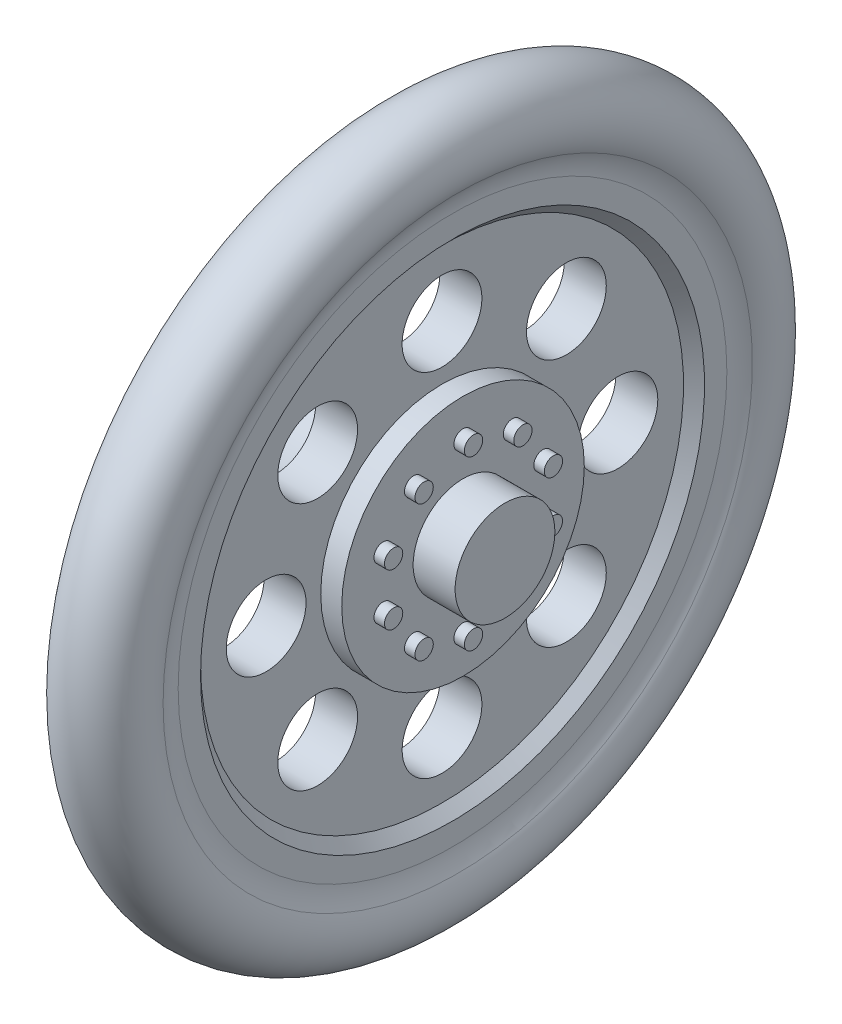
ISO-10303-21;
HEADER;
FILE_DESCRIPTION(('STEP AP214'),'2;1');
FILE_NAME('part.step','',(''),(''),'','','');
FILE_SCHEMA(('AUTOMOTIVE_DESIGN { 1 0 10303 214 1 1 1 1 }'));
ENDSEC;
DATA;
#1=APPLICATION_CONTEXT('core data for automotive mechanical design processes');
#2=APPLICATION_PROTOCOL_DEFINITION('international standard','automotive_design',2000,#1);
#3=PRODUCT_CONTEXT('',#1,'mechanical');
#4=PRODUCT('Part','Part','',(#3));
#5=PRODUCT_RELATED_PRODUCT_CATEGORY('part','',(#4));
#6=PRODUCT_DEFINITION_FORMATION('','',#4);
#7=PRODUCT_DEFINITION_CONTEXT('part definition',#1,'design');
#8=PRODUCT_DEFINITION('design','',#6,#7);
#9=PRODUCT_DEFINITION_SHAPE('','',#8);
#10=(LENGTH_UNIT() NAMED_UNIT(*) SI_UNIT(.MILLI.,.METRE.));
#11=(NAMED_UNIT(*) PLANE_ANGLE_UNIT() SI_UNIT($,.RADIAN.));
#12=(NAMED_UNIT(*) SI_UNIT($,.STERADIAN.) SOLID_ANGLE_UNIT());
#13=UNCERTAINTY_MEASURE_WITH_UNIT(LENGTH_MEASURE(1.E-05),#10,'distance_accuracy_value','');
#14=(GEOMETRIC_REPRESENTATION_CONTEXT(3) GLOBAL_UNCERTAINTY_ASSIGNED_CONTEXT((#13)) GLOBAL_UNIT_ASSIGNED_CONTEXT((#10,
#11,#12)) REPRESENTATION_CONTEXT('',''));
#15=CARTESIAN_POINT('',(0.,0.,0.));
#16=DIRECTION('',(0.,0.,1.));
#17=DIRECTION('',(1.,0.,0.));
#18=AXIS2_PLACEMENT_3D('',#15,#16,#17);
#19=CARTESIAN_POINT('',(10.5,0.,0.));
#20=DIRECTION('',(1.,0.,0.));
#21=DIRECTION('',(0.,0.,-1.));
#22=AXIS2_PLACEMENT_3D('',#19,#20,#21);
#23=PLANE('',#22);
#24=CARTESIAN_POINT('',(10.5,1.23606797749983,-3.8042260651806));
#25=DIRECTION('',(1.,0.,0.));
#26=DIRECTION('',(0.,-0.95105651629515,-0.309016994374958));
#27=AXIS2_PLACEMENT_3D('',#24,#25,#26);
#28=CIRCLE('',#27,0.435);
#29=CARTESIAN_POINT('',(10.5,0.822358392911443,-3.93864845773371));
#30=VERTEX_POINT('',#29);
#31=EDGE_CURVE('E100',#30,#30,#28,.T.);
#32=ORIENTED_EDGE('',*,*,#31,.F.);
#33=EDGE_LOOP('',(#32));
#34=FACE_BOUND('',#33,.T.);
#35=CARTESIAN_POINT('',(10.5,-3.23606797749977,-2.35114100916992));
#36=DIRECTION('',(1.,0.,0.));
#37=DIRECTION('',(0.,-0.58778525229248,0.809016994374942));
#38=AXIS2_PLACEMENT_3D('',#35,#36,#37);
#39=CIRCLE('',#38,0.435);
#40=CARTESIAN_POINT('',(10.5,-3.491754562247,-1.99921861661682));
#41=VERTEX_POINT('',#40);
#42=EDGE_CURVE('E112',#41,#41,#39,.T.);
#43=ORIENTED_EDGE('',*,*,#42,.F.);
#44=EDGE_LOOP('',(#43));
#45=FACE_BOUND('',#44,.T.);
#46=CARTESIAN_POINT('',(10.5,-3.2360679774998,2.35114100916987));
#47=DIRECTION('',(1.,0.,0.));
#48=DIRECTION('',(0.,0.587785252292469,0.809016994374951));
#49=AXIS2_PLACEMENT_3D('',#46,#47,#48);
#50=CIRCLE('',#49,0.435);
#51=CARTESIAN_POINT('',(10.5,-2.98038139275258,2.70306340172298));
#52=VERTEX_POINT('',#51);
#53=EDGE_CURVE('E124',#52,#52,#50,.T.);
#54=ORIENTED_EDGE('',*,*,#53,.F.);
#55=EDGE_LOOP('',(#54));
#56=FACE_BOUND('',#55,.T.);
#57=CARTESIAN_POINT('',(10.5,1.23606797749978,3.80422606518062));
#58=DIRECTION('',(1.,0.,0.));
#59=DIRECTION('',(0.,0.951056516295155,-0.309016994374945));
#60=AXIS2_PLACEMENT_3D('',#57,#58,#59);
#61=CIRCLE('',#60,0.435);
#62=CARTESIAN_POINT('',(10.5,1.64977756208817,3.66980367262752));
#63=VERTEX_POINT('',#62);
#64=EDGE_CURVE('E136',#63,#63,#61,.T.);
#65=ORIENTED_EDGE('',*,*,#64,.F.);
#66=EDGE_LOOP('',(#65));
#67=FACE_BOUND('',#66,.T.);
#68=CARTESIAN_POINT('',(10.5,4.,0.));
#69=DIRECTION('',(1.,0.,0.));
#70=DIRECTION('',(0.,0.,-1.));
#71=AXIS2_PLACEMENT_3D('',#68,#69,#70);
#72=CIRCLE('',#71,0.435);
#73=CARTESIAN_POINT('',(10.5,4.,-0.435));
#74=VERTEX_POINT('',#73);
#75=EDGE_CURVE('E148',#74,#74,#72,.T.);
#76=ORIENTED_EDGE('',*,*,#75,.F.);
#77=EDGE_LOOP('',(#76));
#78=FACE_BOUND('',#77,.T.);
#79=CARTESIAN_POINT('',(10.5,0.,0.));
#80=DIRECTION('',(1.,0.,0.));
#81=DIRECTION('',(0.,0.,-1.));
#82=AXIS2_PLACEMENT_3D('',#79,#80,#81);
#83=CIRCLE('',#82,5.775);
#84=CARTESIAN_POINT('',(10.5,0.,-5.775));
#85=VERTEX_POINT('',#84);
#86=EDGE_CURVE('E160',#85,#85,#83,.T.);
#87=ORIENTED_EDGE('',*,*,#86,.T.);
#88=EDGE_LOOP('',(#87));
#89=FACE_BOUND('',#88,.T.);
#90=CARTESIAN_POINT('',(10.5,0.,0.));
#91=DIRECTION('',(1.,0.,0.));
#92=DIRECTION('',(0.,0.,-1.));
#93=AXIS2_PLACEMENT_3D('',#90,#91,#92);
#94=CIRCLE('',#93,2.375);
#95=CARTESIAN_POINT('',(10.5,0.,-2.375));
#96=VERTEX_POINT('',#95);
#97=EDGE_CURVE('E154',#96,#96,#94,.T.);
#98=ORIENTED_EDGE('',*,*,#97,.F.);
#99=EDGE_LOOP('',(#98));
#100=FACE_BOUND('',#99,.T.);
#101=CARTESIAN_POINT('',(10.5,3.23606797749979,2.3511410091699));
#102=DIRECTION('',(1.,0.,0.));
#103=DIRECTION('',(0.,0.587785252292474,-0.809016994374947));
#104=AXIS2_PLACEMENT_3D('',#101,#102,#103);
#105=CIRCLE('',#104,0.435);
#106=CARTESIAN_POINT('',(10.5,3.49175456224701,1.9992186166168));
#107=VERTEX_POINT('',#106);
#108=EDGE_CURVE('E142',#107,#107,#105,.T.);
#109=ORIENTED_EDGE('',*,*,#108,.F.);
#110=EDGE_LOOP('',(#109));
#111=FACE_BOUND('',#110,.T.);
#112=CARTESIAN_POINT('',(10.5,-1.23606797749981,3.80422606518061));
#113=DIRECTION('',(1.,0.,0.));
#114=DIRECTION('',(0.,0.951056516295152,0.309016994374952));
#115=AXIS2_PLACEMENT_3D('',#112,#113,#114);
#116=CIRCLE('',#115,0.435);
#117=CARTESIAN_POINT('',(10.5,-0.822358392911415,3.93864845773371));
#118=VERTEX_POINT('',#117);
#119=EDGE_CURVE('E130',#118,#118,#116,.T.);
#120=ORIENTED_EDGE('',*,*,#119,.F.);
#121=EDGE_LOOP('',(#120));
#122=FACE_BOUND('',#121,.T.);
#123=CARTESIAN_POINT('',(10.5,-4.,0.));
#124=DIRECTION('',(1.,0.,0.));
#125=DIRECTION('',(0.,0.,1.));
#126=AXIS2_PLACEMENT_3D('',#123,#124,#125);
#127=CIRCLE('',#126,0.435);
#128=CARTESIAN_POINT('',(10.5,-4.,0.434999999999972));
#129=VERTEX_POINT('',#128);
#130=EDGE_CURVE('E118',#129,#129,#127,.T.);
#131=ORIENTED_EDGE('',*,*,#130,.F.);
#132=EDGE_LOOP('',(#131));
#133=FACE_BOUND('',#132,.T.);
#134=CARTESIAN_POINT('',(10.5,-1.23606797749975,-3.80422606518063));
#135=DIRECTION('',(1.,0.,0.));
#136=DIRECTION('',(0.,-0.951056516295157,0.309016994374938));
#137=AXIS2_PLACEMENT_3D('',#134,#135,#136);
#138=CIRCLE('',#137,0.435);
#139=CARTESIAN_POINT('',(10.5,-1.64977756208815,-3.66980367262753));
#140=VERTEX_POINT('',#139);
#141=EDGE_CURVE('E106',#140,#140,#138,.T.);
#142=ORIENTED_EDGE('',*,*,#141,.F.);
#143=EDGE_LOOP('',(#142));
#144=FACE_BOUND('',#143,.T.);
#145=CARTESIAN_POINT('',(10.5,3.23606797749982,-2.35114100916985));
#146=DIRECTION('',(1.,0.,0.));
#147=DIRECTION('',(0.,-0.587785252292462,-0.809016994374955));
#148=AXIS2_PLACEMENT_3D('',#145,#146,#147);
#149=CIRCLE('',#148,0.435);
#150=CARTESIAN_POINT('',(10.5,2.9803813927526,-2.70306340172296));
#151=VERTEX_POINT('',#150);
#152=EDGE_CURVE('E50',#151,#151,#149,.T.);
#153=ORIENTED_EDGE('',*,*,#152,.F.);
#154=EDGE_LOOP('',(#153));
#155=FACE_BOUND('',#154,.T.);
#156=ADVANCED_FACE('F30',(#34,#45,#56,#67,#78,#89,#100,#111,#122,#133,#144,#155),#23,.T.);
#157=CARTESIAN_POINT('',(9.5,11.5,0.));
#158=DIRECTION('',(-1.,0.,0.));
#159=DIRECTION('',(0.,0.,1.));
#160=AXIS2_PLACEMENT_3D('',#157,#158,#159);
#161=PLANE('',#160);
#162=CARTESIAN_POINT('',(9.5,5.92201929243741,-5.92201929243726));
#163=DIRECTION('',(1.,0.,0.));
#164=DIRECTION('',(0.,-0.707106781186539,-0.707106781186556));
#165=AXIS2_PLACEMENT_3D('',#162,#163,#164);
#166=CIRCLE('',#165,1.9);
#167=CARTESIAN_POINT('',(9.5,4.57851640818298,-7.26552217669172));
#168=VERTEX_POINT('',#167);
#169=EDGE_CURVE('E83',#168,#168,#166,.T.);
#170=ORIENTED_EDGE('',*,*,#169,.F.);
#171=EDGE_LOOP('',(#170));
#172=FACE_BOUND('',#171,.T.);
#173=CARTESIAN_POINT('',(9.5,0.,-8.375));
#174=DIRECTION('',(1.,0.,0.));
#175=DIRECTION('',(0.,-1.,0.));
#176=AXIS2_PLACEMENT_3D('',#173,#174,#175);
#177=CIRCLE('',#176,1.9);
#178=CARTESIAN_POINT('',(9.5,-1.89999999999991,-8.37500000000002));
#179=VERTEX_POINT('',#178);
#180=EDGE_CURVE('E73',#179,#179,#177,.T.);
#181=ORIENTED_EDGE('',*,*,#180,.F.);
#182=EDGE_LOOP('',(#181));
#183=FACE_BOUND('',#182,.T.);
#184=CARTESIAN_POINT('',(9.5,-5.92201929243728,-5.92201929243739));
#185=DIRECTION('',(1.,0.,0.));
#186=DIRECTION('',(0.,-0.707106781186554,0.707106781186541));
#187=AXIS2_PLACEMENT_3D('',#184,#185,#186);
#188=CIRCLE('',#187,1.9);
#189=CARTESIAN_POINT('',(9.5,-7.26552217669174,-4.57851640818296));
#190=VERTEX_POINT('',#189);
#191=EDGE_CURVE('E70',#190,#190,#188,.T.);
#192=ORIENTED_EDGE('',*,*,#191,.F.);
#193=EDGE_LOOP('',(#192));
#194=FACE_BOUND('',#193,.T.);
#195=CARTESIAN_POINT('',(9.5,-8.375,0.));
#196=DIRECTION('',(1.,0.,0.));
#197=DIRECTION('',(0.,0.,1.));
#198=AXIS2_PLACEMENT_3D('',#195,#196,#197);
#199=CIRCLE('',#198,1.9);
#200=CARTESIAN_POINT('',(9.5,-8.37500000000001,1.89999999999994));
#201=VERTEX_POINT('',#200);
#202=EDGE_CURVE('E67',#201,#201,#199,.T.);
#203=ORIENTED_EDGE('',*,*,#202,.F.);
#204=EDGE_LOOP('',(#203));
#205=FACE_BOUND('',#204,.T.);
#206=CARTESIAN_POINT('',(9.5,-5.92201929243737,5.92201929243731));
#207=DIRECTION('',(1.,0.,0.));
#208=DIRECTION('',(0.,0.707106781186544,0.707106781186551));
#209=AXIS2_PLACEMENT_3D('',#206,#207,#208);
#210=CIRCLE('',#209,1.9);
#211=CARTESIAN_POINT('',(9.5,-4.57851640818293,7.26552217669175));
#212=VERTEX_POINT('',#211);
#213=EDGE_CURVE('E63',#212,#212,#210,.T.);
#214=ORIENTED_EDGE('',*,*,#213,.F.);
#215=EDGE_LOOP('',(#214));
#216=FACE_BOUND('',#215,.T.);
#217=CARTESIAN_POINT('',(9.5,0.,8.375));
#218=DIRECTION('',(1.,0.,0.));
#219=DIRECTION('',(0.,1.,0.));
#220=AXIS2_PLACEMENT_3D('',#217,#218,#219);
#221=CIRCLE('',#220,1.9);
#222=CARTESIAN_POINT('',(9.5,1.89999999999997,8.37500000000001));
#223=VERTEX_POINT('',#222);
#224=EDGE_CURVE('E59',#223,#223,#221,.T.);
#225=ORIENTED_EDGE('',*,*,#224,.F.);
#226=EDGE_LOOP('',(#225));
#227=FACE_BOUND('',#226,.T.);
#228=CARTESIAN_POINT('',(9.5,5.92201929243732,5.92201929243735));
#229=DIRECTION('',(1.,0.,0.));
#230=DIRECTION('',(0.,0.707106781186549,-0.707106781186546));
#231=AXIS2_PLACEMENT_3D('',#228,#229,#230);
#232=CIRCLE('',#231,1.9);
#233=CARTESIAN_POINT('',(9.5,7.26552217669177,4.57851640818291));
#234=VERTEX_POINT('',#233);
#235=EDGE_CURVE('E55',#234,#234,#232,.T.);
#236=ORIENTED_EDGE('',*,*,#235,.F.);
#237=EDGE_LOOP('',(#236));
#238=FACE_BOUND('',#237,.T.);
#239=CARTESIAN_POINT('',(9.5,8.375,0.));
#240=DIRECTION('',(1.,0.,0.));
#241=DIRECTION('',(0.,0.,-1.));
#242=AXIS2_PLACEMENT_3D('',#239,#240,#241);
#243=CIRCLE('',#242,1.9);
#244=CARTESIAN_POINT('',(9.5,8.375,-1.9));
#245=VERTEX_POINT('',#244);
#246=EDGE_CURVE('E51',#245,#245,#243,.T.);
#247=ORIENTED_EDGE('',*,*,#246,.F.);
#248=EDGE_LOOP('',(#247));
#249=FACE_BOUND('',#248,.T.);
#250=CARTESIAN_POINT('',(9.5,0.,0.));
#251=DIRECTION('',(-1.,0.,0.));
#252=DIRECTION('',(0.,0.,1.));
#253=AXIS2_PLACEMENT_3D('',#250,#251,#252);
#254=CIRCLE('',#253,11.5);
#255=CARTESIAN_POINT('',(9.5,0.,11.5));
#256=VERTEX_POINT('',#255);
#257=EDGE_CURVE('E180',#256,#256,#254,.T.);
#258=ORIENTED_EDGE('',*,*,#257,.F.);
#259=EDGE_LOOP('',(#258));
#260=FACE_BOUND('',#259,.T.);
#261=CARTESIAN_POINT('',(9.5,0.,0.));
#262=DIRECTION('',(-1.,0.,0.));
#263=DIRECTION('',(0.,0.,1.));
#264=AXIS2_PLACEMENT_3D('',#261,#262,#263);
#265=CIRCLE('',#264,5.775);
#266=CARTESIAN_POINT('',(9.5,0.,5.775));
#267=VERTEX_POINT('',#266);
#268=EDGE_CURVE('E11',#267,#267,#265,.F.);
#269=ORIENTED_EDGE('',*,*,#268,.F.);
#270=EDGE_LOOP('',(#269));
#271=FACE_BOUND('',#270,.T.);
#272=ADVANCED_FACE('F218',(#172,#183,#194,#205,#216,#227,#238,#249,#260,#271),#161,.F.);
#273=CARTESIAN_POINT('',(0.,0.,0.));
#274=DIRECTION('',(1.,0.,0.));
#275=DIRECTION('',(0.,0.,-1.));
#276=AXIS2_PLACEMENT_3D('',#273,#274,#275);
#277=PLANE('',#276);
#278=CARTESIAN_POINT('',(0.,0.,0.));
#279=DIRECTION('',(-1.,0.,0.));
#280=DIRECTION('',(0.,0.,1.));
#281=AXIS2_PLACEMENT_3D('',#278,#279,#280);
#282=CIRCLE('',#281,1.63);
#283=CARTESIAN_POINT('',(0.,0.,1.63));
#284=VERTEX_POINT('',#283);
#285=EDGE_CURVE('E636',#284,#284,#282,.T.);
#286=ORIENTED_EDGE('',*,*,#285,.F.);
#287=EDGE_LOOP('',(#286));
#288=FACE_BOUND('',#287,.T.);
#289=CARTESIAN_POINT('',(0.,0.,0.));
#290=DIRECTION('',(-1.,0.,0.));
#291=DIRECTION('',(0.,0.,1.));
#292=AXIS2_PLACEMENT_3D('',#289,#290,#291);
#293=CIRCLE('',#292,3.1);
#294=CARTESIAN_POINT('',(0.,0.,3.1));
#295=VERTEX_POINT('',#294);
#296=EDGE_CURVE('E165',#295,#295,#293,.T.);
#297=ORIENTED_EDGE('',*,*,#296,.T.);
#298=EDGE_LOOP('',(#297));
#299=FACE_BOUND('',#298,.T.);
#300=ADVANCED_FACE('F224',(#288,#299),#277,.F.);
#301=CARTESIAN_POINT('',(9.5,0.,0.));
#302=DIRECTION('',(1.,0.,0.));
#303=DIRECTION('',(0.,0.,-1.));
#304=AXIS2_PLACEMENT_3D('',#301,#302,#303);
#305=CONICAL_SURFACE('',#304,11.5,0.785398163397452);
#306=CARTESIAN_POINT('',(10.,0.,0.));
#307=DIRECTION('',(-1.,0.,0.));
#308=DIRECTION('',(0.,0.,1.));
#309=AXIS2_PLACEMENT_3D('',#306,#307,#308);
#310=CIRCLE('',#309,12.);
#311=CARTESIAN_POINT('',(10.,0.,12.));
#312=VERTEX_POINT('',#311);
#313=EDGE_CURVE('E177',#312,#312,#310,.T.);
#314=ORIENTED_EDGE('',*,*,#313,.F.);
#315=EDGE_LOOP('',(#314));
#316=FACE_BOUND('',#315,.T.);
#317=ORIENTED_EDGE('',*,*,#257,.T.);
#318=EDGE_LOOP('',(#317));
#319=FACE_BOUND('',#318,.T.);
#320=ADVANCED_FACE('F248',(#316,#319),#305,.F.);
#321=CARTESIAN_POINT('',(10.,13.6771243444677,0.));
#322=DIRECTION('',(-1.,0.,0.));
#323=DIRECTION('',(0.,0.,1.));
#324=AXIS2_PLACEMENT_3D('',#321,#322,#323);
#325=PLANE('',#324);
#326=CARTESIAN_POINT('',(10.,0.,0.));
#327=DIRECTION('',(-1.,0.,0.));
#328=DIRECTION('',(0.,0.,1.));
#329=AXIS2_PLACEMENT_3D('',#326,#327,#328);
#330=CIRCLE('',#329,13.0635083268963);
#331=CARTESIAN_POINT('',(10.,0.,13.0635083268963));
#332=VERTEX_POINT('',#331);
#333=EDGE_CURVE('E38',#332,#332,#330,.F.);
#334=ORIENTED_EDGE('',*,*,#333,.T.);
#335=EDGE_LOOP('',(#334));
#336=FACE_BOUND('',#335,.T.);
#337=ORIENTED_EDGE('',*,*,#313,.T.);
#338=EDGE_LOOP('',(#337));
#339=FACE_BOUND('',#338,.T.);
#340=ADVANCED_FACE('F254',(#336,#339),#325,.F.);
#341=CARTESIAN_POINT('',(8.5,0.,0.));
#342=DIRECTION('',(-1.,0.,0.));
#343=DIRECTION('',(0.,0.,1.));
#344=AXIS2_PLACEMENT_3D('',#341,#342,#343);
#345=TOROIDAL_SURFACE('',#344,15.,2.);
#346=CARTESIAN_POINT('',(6.74999999999996,0.,0.));
#347=DIRECTION('',(1.,0.,0.));
#348=DIRECTION('',(0.,0.,-1.));
#349=AXIS2_PLACEMENT_3D('',#346,#347,#348);
#350=CIRCLE('',#349,14.0317541634481);
#351=CARTESIAN_POINT('',(6.74999999999996,0.,-14.0317541634481));
#352=VERTEX_POINT('',#351);
#353=EDGE_CURVE('E43',#352,#352,#350,.T.);
#354=ORIENTED_EDGE('',*,*,#353,.T.);
#355=EDGE_LOOP('',(#354));
#356=FACE_BOUND('',#355,.T.);
#357=CARTESIAN_POINT('',(10.25,0.,0.));
#358=DIRECTION('',(-1.,0.,0.));
#359=DIRECTION('',(0.,0.,1.));
#360=AXIS2_PLACEMENT_3D('',#357,#358,#359);
#361=CIRCLE('',#360,14.0317541634481);
#362=CARTESIAN_POINT('',(10.25,0.,14.0317541634481));
#363=VERTEX_POINT('',#362);
#364=EDGE_CURVE('E186',#363,#363,#361,.T.);
#365=ORIENTED_EDGE('',*,*,#364,.T.);
#366=EDGE_LOOP('',(#365));
#367=FACE_BOUND('',#366,.T.);
#368=ADVANCED_FACE('F191',(#356,#367),#345,.T.);
#369=CARTESIAN_POINT('',(7.,13.6771243444677,0.));
#370=DIRECTION('',(1.,0.,0.));
#371=DIRECTION('',(0.,0.,-1.));
#372=AXIS2_PLACEMENT_3D('',#369,#370,#371);
#373=PLANE('',#372);
#374=CARTESIAN_POINT('',(7.,0.,0.));
#375=DIRECTION('',(1.,0.,0.));
#376=DIRECTION('',(0.,0.,-1.));
#377=AXIS2_PLACEMENT_3D('',#374,#375,#376);
#378=CIRCLE('',#377,13.0635083268963);
#379=CARTESIAN_POINT('',(7.,0.,-13.0635083268963));
#380=VERTEX_POINT('',#379);
#381=EDGE_CURVE('E183',#380,#380,#378,.F.);
#382=ORIENTED_EDGE('',*,*,#381,.T.);
#383=EDGE_LOOP('',(#382));
#384=FACE_BOUND('',#383,.T.);
#385=CARTESIAN_POINT('',(7.,0.,0.));
#386=DIRECTION('',(-1.,0.,0.));
#387=DIRECTION('',(0.,0.,1.));
#388=AXIS2_PLACEMENT_3D('',#385,#386,#387);
#389=CIRCLE('',#388,12.);
#390=CARTESIAN_POINT('',(7.,0.,12.));
#391=VERTEX_POINT('',#390);
#392=EDGE_CURVE('E174',#391,#391,#389,.T.);
#393=ORIENTED_EDGE('',*,*,#392,.F.);
#394=EDGE_LOOP('',(#393));
#395=FACE_BOUND('',#394,.T.);
#396=ADVANCED_FACE('F200',(#384,#395),#373,.F.);
#397=CARTESIAN_POINT('',(7.,0.,0.));
#398=DIRECTION('',(-1.,0.,0.));
#399=DIRECTION('',(0.,0.,1.));
#400=AXIS2_PLACEMENT_3D('',#397,#398,#399);
#401=CONICAL_SURFACE('',#400,12.,0.785398163397453);
#402=CARTESIAN_POINT('',(7.5,0.,0.));
#403=DIRECTION('',(-1.,0.,0.));
#404=DIRECTION('',(0.,0.,1.));
#405=AXIS2_PLACEMENT_3D('',#402,#403,#404);
#406=CIRCLE('',#405,11.5);
#407=CARTESIAN_POINT('',(7.5,0.,11.5));
#408=VERTEX_POINT('',#407);
#409=EDGE_CURVE('E171',#408,#408,#406,.T.);
#410=ORIENTED_EDGE('',*,*,#409,.F.);
#411=EDGE_LOOP('',(#410));
#412=FACE_BOUND('',#411,.T.);
#413=ORIENTED_EDGE('',*,*,#392,.T.);
#414=EDGE_LOOP('',(#413));
#415=FACE_BOUND('',#414,.T.);
#416=ADVANCED_FACE('F203',(#412,#415),#401,.F.);
#417=CARTESIAN_POINT('',(7.5,3.1,0.));
#418=DIRECTION('',(1.,0.,0.));
#419=DIRECTION('',(0.,0.,-1.));
#420=AXIS2_PLACEMENT_3D('',#417,#418,#419);
#421=PLANE('',#420);
#422=CARTESIAN_POINT('',(7.5,5.92201929243741,-5.92201929243726));
#423=DIRECTION('',(1.,0.,0.));
#424=DIRECTION('',(0.,0.,-1.));
#425=AXIS2_PLACEMENT_3D('',#422,#423,#424);
#426=CIRCLE('',#425,1.9);
#427=CARTESIAN_POINT('',(7.5,5.92201929243741,-7.82201929243726));
#428=VERTEX_POINT('',#427);
#429=EDGE_CURVE('E34',#428,#428,#426,.T.);
#430=ORIENTED_EDGE('',*,*,#429,.T.);
#431=EDGE_LOOP('',(#430));
#432=FACE_BOUND('',#431,.T.);
#433=CARTESIAN_POINT('',(7.5,0.,-8.375));
#434=DIRECTION('',(1.,0.,0.));
#435=DIRECTION('',(0.,0.,-1.));
#436=AXIS2_PLACEMENT_3D('',#433,#434,#435);
#437=CIRCLE('',#436,1.9);
#438=CARTESIAN_POINT('',(7.5,0.,-10.275));
#439=VERTEX_POINT('',#438);
#440=EDGE_CURVE('E71',#439,#439,#437,.T.);
#441=ORIENTED_EDGE('',*,*,#440,.T.);
#442=EDGE_LOOP('',(#441));
#443=FACE_BOUND('',#442,.T.);
#444=CARTESIAN_POINT('',(7.5,-5.92201929243728,-5.92201929243739));
#445=DIRECTION('',(1.,0.,0.));
#446=DIRECTION('',(0.,0.,-1.));
#447=AXIS2_PLACEMENT_3D('',#444,#445,#446);
#448=CIRCLE('',#447,1.9);
#449=CARTESIAN_POINT('',(7.5,-5.92201929243728,-7.82201929243739));
#450=VERTEX_POINT('',#449);
#451=EDGE_CURVE('E68',#450,#450,#448,.T.);
#452=ORIENTED_EDGE('',*,*,#451,.T.);
#453=EDGE_LOOP('',(#452));
#454=FACE_BOUND('',#453,.T.);
#455=CARTESIAN_POINT('',(7.5,-8.375,0.));
#456=DIRECTION('',(1.,0.,0.));
#457=DIRECTION('',(0.,0.,-1.));
#458=AXIS2_PLACEMENT_3D('',#455,#456,#457);
#459=CIRCLE('',#458,1.9);
#460=CARTESIAN_POINT('',(7.5,-8.375,-1.90000000000006));
#461=VERTEX_POINT('',#460);
#462=EDGE_CURVE('E64',#461,#461,#459,.T.);
#463=ORIENTED_EDGE('',*,*,#462,.T.);
#464=EDGE_LOOP('',(#463));
#465=FACE_BOUND('',#464,.T.);
#466=CARTESIAN_POINT('',(7.5,-5.92201929243737,5.92201929243731));
#467=DIRECTION('',(1.,0.,0.));
#468=DIRECTION('',(0.,0.,-1.));
#469=AXIS2_PLACEMENT_3D('',#466,#467,#468);
#470=CIRCLE('',#469,1.9);
#471=CARTESIAN_POINT('',(7.5,-5.92201929243737,4.0220192924373));
#472=VERTEX_POINT('',#471);
#473=EDGE_CURVE('E60',#472,#472,#470,.T.);
#474=ORIENTED_EDGE('',*,*,#473,.T.);
#475=EDGE_LOOP('',(#474));
#476=FACE_BOUND('',#475,.T.);
#477=CARTESIAN_POINT('',(7.5,0.,8.375));
#478=DIRECTION('',(1.,0.,0.));
#479=DIRECTION('',(0.,0.,-1.));
#480=AXIS2_PLACEMENT_3D('',#477,#478,#479);
#481=CIRCLE('',#480,1.9);
#482=CARTESIAN_POINT('',(7.5,0.,6.475));
#483=VERTEX_POINT('',#482);
#484=EDGE_CURVE('E56',#483,#483,#481,.T.);
#485=ORIENTED_EDGE('',*,*,#484,.T.);
#486=EDGE_LOOP('',(#485));
#487=FACE_BOUND('',#486,.T.);
#488=CARTESIAN_POINT('',(7.5,5.92201929243732,5.92201929243735));
#489=DIRECTION('',(1.,0.,0.));
#490=DIRECTION('',(0.,0.,-1.));
#491=AXIS2_PLACEMENT_3D('',#488,#489,#490);
#492=CIRCLE('',#491,1.9);
#493=CARTESIAN_POINT('',(7.5,5.92201929243732,4.02201929243734));
#494=VERTEX_POINT('',#493);
#495=EDGE_CURVE('E52',#494,#494,#492,.T.);
#496=ORIENTED_EDGE('',*,*,#495,.T.);
#497=EDGE_LOOP('',(#496));
#498=FACE_BOUND('',#497,.T.);
#499=CARTESIAN_POINT('',(7.5,8.375,0.));
#500=DIRECTION('',(1.,0.,0.));
#501=DIRECTION('',(0.,0.,-1.));
#502=AXIS2_PLACEMENT_3D('',#499,#500,#501);
#503=CIRCLE('',#502,1.9);
#504=CARTESIAN_POINT('',(7.5,8.375,-1.9));
#505=VERTEX_POINT('',#504);
#506=EDGE_CURVE('E47',#505,#505,#503,.T.);
#507=ORIENTED_EDGE('',*,*,#506,.T.);
#508=EDGE_LOOP('',(#507));
#509=FACE_BOUND('',#508,.T.);
#510=CARTESIAN_POINT('',(7.5,0.,0.));
#511=DIRECTION('',(-1.,0.,0.));
#512=DIRECTION('',(0.,0.,1.));
#513=AXIS2_PLACEMENT_3D('',#510,#511,#512);
#514=CIRCLE('',#513,3.1);
#515=CARTESIAN_POINT('',(7.5,0.,3.1));
#516=VERTEX_POINT('',#515);
#517=EDGE_CURVE('E168',#516,#516,#514,.T.);
#518=ORIENTED_EDGE('',*,*,#517,.F.);
#519=EDGE_LOOP('',(#518));
#520=FACE_BOUND('',#519,.T.);
#521=ORIENTED_EDGE('',*,*,#409,.T.);
#522=EDGE_LOOP('',(#521));
#523=FACE_BOUND('',#522,.T.);
#524=ADVANCED_FACE('F208',(#432,#443,#454,#465,#476,#487,#498,#509,#520,#523),#421,.F.);
#525=CARTESIAN_POINT('',(0.,0.,0.));
#526=DIRECTION('',(-1.,0.,0.));
#527=DIRECTION('',(0.,0.,1.));
#528=AXIS2_PLACEMENT_3D('',#525,#526,#527);
#529=CYLINDRICAL_SURFACE('',#528,3.1);
#530=ORIENTED_EDGE('',*,*,#296,.F.);
#531=EDGE_LOOP('',(#530));
#532=FACE_BOUND('',#531,.T.);
#533=ORIENTED_EDGE('',*,*,#517,.T.);
#534=EDGE_LOOP('',(#533));
#535=FACE_BOUND('',#534,.T.);
#536=ADVANCED_FACE('F197',(#532,#535),#529,.T.);
#537=CARTESIAN_POINT('',(5.,0.,0.));
#538=DIRECTION('',(-1.,0.,0.));
#539=DIRECTION('',(0.,0.,1.));
#540=AXIS2_PLACEMENT_3D('',#537,#538,#539);
#541=TOROIDAL_SURFACE('',#540,13.0635083268963,2.);
#542=ORIENTED_EDGE('',*,*,#353,.F.);
#543=EDGE_LOOP('',(#542));
#544=FACE_BOUND('',#543,.T.);
#545=ORIENTED_EDGE('',*,*,#381,.F.);
#546=EDGE_LOOP('',(#545));
#547=FACE_BOUND('',#546,.T.);
#548=ADVANCED_FACE('F194',(#544,#547),#541,.F.);
#549=CARTESIAN_POINT('',(12.,0.,0.));
#550=DIRECTION('',(1.,0.,0.));
#551=DIRECTION('',(0.,0.,-1.));
#552=AXIS2_PLACEMENT_3D('',#549,#550,#551);
#553=TOROIDAL_SURFACE('',#552,13.0635083268963,2.);
#554=ORIENTED_EDGE('',*,*,#333,.F.);
#555=EDGE_LOOP('',(#554));
#556=FACE_BOUND('',#555,.T.);
#557=ORIENTED_EDGE('',*,*,#364,.F.);
#558=EDGE_LOOP('',(#557));
#559=FACE_BOUND('',#558,.T.);
#560=ADVANCED_FACE('F32',(#556,#559),#553,.F.);
#561=CARTESIAN_POINT('',(10.5,0.,0.));
#562=DIRECTION('',(-1.,0.,0.));
#563=DIRECTION('',(0.,0.,1.));
#564=AXIS2_PLACEMENT_3D('',#561,#562,#563);
#565=CYLINDRICAL_SURFACE('',#564,5.775);
#566=ORIENTED_EDGE('',*,*,#86,.F.);
#567=EDGE_LOOP('',(#566));
#568=FACE_BOUND('',#567,.T.);
#569=ORIENTED_EDGE('',*,*,#268,.T.);
#570=EDGE_LOOP('',(#569));
#571=FACE_BOUND('',#570,.T.);
#572=ADVANCED_FACE('F233',(#568,#571),#565,.T.);
#573=CARTESIAN_POINT('',(12.5,0.,0.));
#574=DIRECTION('',(-1.,0.,0.));
#575=DIRECTION('',(0.,0.,1.));
#576=AXIS2_PLACEMENT_3D('',#573,#574,#575);
#577=CYLINDRICAL_SURFACE('',#576,2.375);
#578=CARTESIAN_POINT('',(12.5,0.,0.));
#579=DIRECTION('',(1.,0.,0.));
#580=DIRECTION('',(0.,0.,-1.));
#581=AXIS2_PLACEMENT_3D('',#578,#579,#580);
#582=CIRCLE('',#581,2.375);
#583=CARTESIAN_POINT('',(12.5,0.,-2.375));
#584=VERTEX_POINT('',#583);
#585=EDGE_CURVE('E157',#584,#584,#582,.T.);
#586=ORIENTED_EDGE('',*,*,#585,.F.);
#587=EDGE_LOOP('',(#586));
#588=FACE_BOUND('',#587,.T.);
#589=ORIENTED_EDGE('',*,*,#97,.T.);
#590=EDGE_LOOP('',(#589));
#591=FACE_BOUND('',#590,.T.);
#592=ADVANCED_FACE('F231',(#588,#591),#577,.T.);
#593=CARTESIAN_POINT('',(12.5,0.,0.));
#594=DIRECTION('',(1.,0.,0.));
#595=DIRECTION('',(0.,0.,-1.));
#596=AXIS2_PLACEMENT_3D('',#593,#594,#595);
#597=PLANE('',#596);
#598=ORIENTED_EDGE('',*,*,#585,.T.);
#599=EDGE_LOOP('',(#598));
#600=FACE_BOUND('',#599,.T.);
#601=ADVANCED_FACE('F303',(#600),#597,.T.);
#602=CARTESIAN_POINT('',(11.,4.,0.));
#603=DIRECTION('',(-1.,0.,0.));
#604=DIRECTION('',(0.,0.,1.));
#605=AXIS2_PLACEMENT_3D('',#602,#603,#604);
#606=CYLINDRICAL_SURFACE('',#605,0.435);
#607=CARTESIAN_POINT('',(11.,4.,0.));
#608=DIRECTION('',(1.,0.,0.));
#609=DIRECTION('',(0.,0.,-1.));
#610=AXIS2_PLACEMENT_3D('',#607,#608,#609);
#611=CIRCLE('',#610,0.435);
#612=CARTESIAN_POINT('',(11.,4.,-0.435));
#613=VERTEX_POINT('',#612);
#614=EDGE_CURVE('E151',#613,#613,#611,.T.);
#615=ORIENTED_EDGE('',*,*,#614,.F.);
#616=EDGE_LOOP('',(#615));
#617=FACE_BOUND('',#616,.T.);
#618=ORIENTED_EDGE('',*,*,#75,.T.);
#619=EDGE_LOOP('',(#618));
#620=FACE_BOUND('',#619,.T.);
#621=ADVANCED_FACE('F312',(#617,#620),#606,.T.);
#622=CARTESIAN_POINT('',(11.,4.,0.));
#623=DIRECTION('',(1.,0.,0.));
#624=DIRECTION('',(0.,0.,-1.));
#625=AXIS2_PLACEMENT_3D('',#622,#623,#624);
#626=PLANE('',#625);
#627=ORIENTED_EDGE('',*,*,#614,.T.);
#628=EDGE_LOOP('',(#627));
#629=FACE_BOUND('',#628,.T.);
#630=ADVANCED_FACE('F321',(#629),#626,.T.);
#631=CARTESIAN_POINT('',(11.,3.23606797749979,2.3511410091699));
#632=DIRECTION('',(-1.,0.,0.));
#633=DIRECTION('',(0.,0.,1.));
#634=AXIS2_PLACEMENT_3D('',#631,#632,#633);
#635=CYLINDRICAL_SURFACE('',#634,0.435);
#636=CARTESIAN_POINT('',(11.,3.23606797749979,2.3511410091699));
#637=DIRECTION('',(1.,0.,0.));
#638=DIRECTION('',(0.,0.587785252292474,-0.809016994374947));
#639=AXIS2_PLACEMENT_3D('',#636,#637,#638);
#640=CIRCLE('',#639,0.435);
#641=CARTESIAN_POINT('',(11.,3.49175456224701,1.9992186166168));
#642=VERTEX_POINT('',#641);
#643=EDGE_CURVE('E145',#642,#642,#640,.T.);
#644=ORIENTED_EDGE('',*,*,#643,.F.);
#645=EDGE_LOOP('',(#644));
#646=FACE_BOUND('',#645,.T.);
#647=ORIENTED_EDGE('',*,*,#108,.T.);
#648=EDGE_LOOP('',(#647));
#649=FACE_BOUND('',#648,.T.);
#650=ADVANCED_FACE('F330',(#646,#649),#635,.T.);
#651=CARTESIAN_POINT('',(11.,3.23606797749979,2.3511410091699));
#652=DIRECTION('',(1.,0.,0.));
#653=DIRECTION('',(0.,0.587785252292474,-0.809016994374947));
#654=AXIS2_PLACEMENT_3D('',#651,#652,#653);
#655=PLANE('',#654);
#656=ORIENTED_EDGE('',*,*,#643,.T.);
#657=EDGE_LOOP('',(#656));
#658=FACE_BOUND('',#657,.T.);
#659=ADVANCED_FACE('F345',(#658),#655,.T.);
#660=CARTESIAN_POINT('',(11.,1.23606797749978,3.80422606518062));
#661=DIRECTION('',(-1.,0.,0.));
#662=DIRECTION('',(0.,0.,1.));
#663=AXIS2_PLACEMENT_3D('',#660,#661,#662);
#664=CYLINDRICAL_SURFACE('',#663,0.435);
#665=CARTESIAN_POINT('',(11.,1.23606797749978,3.80422606518062));
#666=DIRECTION('',(1.,0.,0.));
#667=DIRECTION('',(0.,0.951056516295155,-0.309016994374945));
#668=AXIS2_PLACEMENT_3D('',#665,#666,#667);
#669=CIRCLE('',#668,0.435);
#670=CARTESIAN_POINT('',(11.,1.64977756208817,3.66980367262752));
#671=VERTEX_POINT('',#670);
#672=EDGE_CURVE('E139',#671,#671,#669,.T.);
#673=ORIENTED_EDGE('',*,*,#672,.F.);
#674=EDGE_LOOP('',(#673));
#675=FACE_BOUND('',#674,.T.);
#676=ORIENTED_EDGE('',*,*,#64,.T.);
#677=EDGE_LOOP('',(#676));
#678=FACE_BOUND('',#677,.T.);
#679=ADVANCED_FACE('F355',(#675,#678),#664,.T.);
#680=CARTESIAN_POINT('',(11.,1.23606797749978,3.80422606518062));
#681=DIRECTION('',(1.,0.,0.));
#682=DIRECTION('',(0.,0.951056516295155,-0.309016994374945));
#683=AXIS2_PLACEMENT_3D('',#680,#681,#682);
#684=PLANE('',#683);
#685=ORIENTED_EDGE('',*,*,#672,.T.);
#686=EDGE_LOOP('',(#685));
#687=FACE_BOUND('',#686,.T.);
#688=ADVANCED_FACE('F365',(#687),#684,.T.);
#689=CARTESIAN_POINT('',(11.,-1.23606797749981,3.80422606518061));
#690=DIRECTION('',(-1.,0.,0.));
#691=DIRECTION('',(0.,0.,1.));
#692=AXIS2_PLACEMENT_3D('',#689,#690,#691);
#693=CYLINDRICAL_SURFACE('',#692,0.435);
#694=CARTESIAN_POINT('',(11.,-1.23606797749981,3.80422606518061));
#695=DIRECTION('',(1.,0.,0.));
#696=DIRECTION('',(0.,0.951056516295152,0.309016994374952));
#697=AXIS2_PLACEMENT_3D('',#694,#695,#696);
#698=CIRCLE('',#697,0.435);
#699=CARTESIAN_POINT('',(11.,-0.822358392911415,3.93864845773371));
#700=VERTEX_POINT('',#699);
#701=EDGE_CURVE('E133',#700,#700,#698,.T.);
#702=ORIENTED_EDGE('',*,*,#701,.F.);
#703=EDGE_LOOP('',(#702));
#704=FACE_BOUND('',#703,.T.);
#705=ORIENTED_EDGE('',*,*,#119,.T.);
#706=EDGE_LOOP('',(#705));
#707=FACE_BOUND('',#706,.T.);
#708=ADVANCED_FACE('F375',(#704,#707),#693,.T.);
#709=CARTESIAN_POINT('',(11.,-1.23606797749981,3.80422606518061));
#710=DIRECTION('',(1.,0.,0.));
#711=DIRECTION('',(0.,0.951056516295152,0.309016994374952));
#712=AXIS2_PLACEMENT_3D('',#709,#710,#711);
#713=PLANE('',#712);
#714=ORIENTED_EDGE('',*,*,#701,.T.);
#715=EDGE_LOOP('',(#714));
#716=FACE_BOUND('',#715,.T.);
#717=ADVANCED_FACE('F385',(#716),#713,.T.);
#718=CARTESIAN_POINT('',(11.,-3.2360679774998,2.35114100916987));
#719=DIRECTION('',(-1.,0.,0.));
#720=DIRECTION('',(0.,0.,1.));
#721=AXIS2_PLACEMENT_3D('',#718,#719,#720);
#722=CYLINDRICAL_SURFACE('',#721,0.435);
#723=CARTESIAN_POINT('',(11.,-3.2360679774998,2.35114100916987));
#724=DIRECTION('',(1.,0.,0.));
#725=DIRECTION('',(0.,0.587785252292469,0.809016994374951));
#726=AXIS2_PLACEMENT_3D('',#723,#724,#725);
#727=CIRCLE('',#726,0.435);
#728=CARTESIAN_POINT('',(11.,-2.98038139275258,2.70306340172298));
#729=VERTEX_POINT('',#728);
#730=EDGE_CURVE('E127',#729,#729,#727,.T.);
#731=ORIENTED_EDGE('',*,*,#730,.F.);
#732=EDGE_LOOP('',(#731));
#733=FACE_BOUND('',#732,.T.);
#734=ORIENTED_EDGE('',*,*,#53,.T.);
#735=EDGE_LOOP('',(#734));
#736=FACE_BOUND('',#735,.T.);
#737=ADVANCED_FACE('F395',(#733,#736),#722,.T.);
#738=CARTESIAN_POINT('',(11.,-3.2360679774998,2.35114100916987));
#739=DIRECTION('',(1.,0.,0.));
#740=DIRECTION('',(0.,0.587785252292469,0.809016994374951));
#741=AXIS2_PLACEMENT_3D('',#738,#739,#740);
#742=PLANE('',#741);
#743=ORIENTED_EDGE('',*,*,#730,.T.);
#744=EDGE_LOOP('',(#743));
#745=FACE_BOUND('',#744,.T.);
#746=ADVANCED_FACE('F405',(#745),#742,.T.);
#747=CARTESIAN_POINT('',(11.,-4.,0.));
#748=DIRECTION('',(-1.,0.,0.));
#749=DIRECTION('',(0.,0.,1.));
#750=AXIS2_PLACEMENT_3D('',#747,#748,#749);
#751=CYLINDRICAL_SURFACE('',#750,0.435);
#752=CARTESIAN_POINT('',(11.,-4.,0.));
#753=DIRECTION('',(1.,0.,0.));
#754=DIRECTION('',(0.,0.,1.));
#755=AXIS2_PLACEMENT_3D('',#752,#753,#754);
#756=CIRCLE('',#755,0.435);
#757=CARTESIAN_POINT('',(11.,-4.,0.434999999999972));
#758=VERTEX_POINT('',#757);
#759=EDGE_CURVE('E121',#758,#758,#756,.T.);
#760=ORIENTED_EDGE('',*,*,#759,.F.);
#761=EDGE_LOOP('',(#760));
#762=FACE_BOUND('',#761,.T.);
#763=ORIENTED_EDGE('',*,*,#130,.T.);
#764=EDGE_LOOP('',(#763));
#765=FACE_BOUND('',#764,.T.);
#766=ADVANCED_FACE('F415',(#762,#765),#751,.T.);
#767=CARTESIAN_POINT('',(11.,-4.,0.));
#768=DIRECTION('',(1.,0.,0.));
#769=DIRECTION('',(0.,0.,1.));
#770=AXIS2_PLACEMENT_3D('',#767,#768,#769);
#771=PLANE('',#770);
#772=ORIENTED_EDGE('',*,*,#759,.T.);
#773=EDGE_LOOP('',(#772));
#774=FACE_BOUND('',#773,.T.);
#775=ADVANCED_FACE('F425',(#774),#771,.T.);
#776=CARTESIAN_POINT('',(11.,-3.23606797749977,-2.35114100916992));
#777=DIRECTION('',(-1.,0.,0.));
#778=DIRECTION('',(0.,0.,1.));
#779=AXIS2_PLACEMENT_3D('',#776,#777,#778);
#780=CYLINDRICAL_SURFACE('',#779,0.435);
#781=CARTESIAN_POINT('',(11.,-3.23606797749977,-2.35114100916992));
#782=DIRECTION('',(1.,0.,0.));
#783=DIRECTION('',(0.,-0.58778525229248,0.809016994374942));
#784=AXIS2_PLACEMENT_3D('',#781,#782,#783);
#785=CIRCLE('',#784,0.435);
#786=CARTESIAN_POINT('',(11.,-3.491754562247,-1.99921861661682));
#787=VERTEX_POINT('',#786);
#788=EDGE_CURVE('E115',#787,#787,#785,.T.);
#789=ORIENTED_EDGE('',*,*,#788,.F.);
#790=EDGE_LOOP('',(#789));
#791=FACE_BOUND('',#790,.T.);
#792=ORIENTED_EDGE('',*,*,#42,.T.);
#793=EDGE_LOOP('',(#792));
#794=FACE_BOUND('',#793,.T.);
#795=ADVANCED_FACE('F435',(#791,#794),#780,.T.);
#796=CARTESIAN_POINT('',(11.,-3.23606797749977,-2.35114100916992));
#797=DIRECTION('',(1.,0.,0.));
#798=DIRECTION('',(0.,-0.58778525229248,0.809016994374942));
#799=AXIS2_PLACEMENT_3D('',#796,#797,#798);
#800=PLANE('',#799);
#801=ORIENTED_EDGE('',*,*,#788,.T.);
#802=EDGE_LOOP('',(#801));
#803=FACE_BOUND('',#802,.T.);
#804=ADVANCED_FACE('F445',(#803),#800,.T.);
#805=CARTESIAN_POINT('',(11.,-1.23606797749975,-3.80422606518063));
#806=DIRECTION('',(-1.,0.,0.));
#807=DIRECTION('',(0.,0.,1.));
#808=AXIS2_PLACEMENT_3D('',#805,#806,#807);
#809=CYLINDRICAL_SURFACE('',#808,0.435);
#810=CARTESIAN_POINT('',(11.,-1.23606797749975,-3.80422606518063));
#811=DIRECTION('',(1.,0.,0.));
#812=DIRECTION('',(0.,-0.951056516295157,0.309016994374938));
#813=AXIS2_PLACEMENT_3D('',#810,#811,#812);
#814=CIRCLE('',#813,0.435);
#815=CARTESIAN_POINT('',(11.,-1.64977756208815,-3.66980367262753));
#816=VERTEX_POINT('',#815);
#817=EDGE_CURVE('E109',#816,#816,#814,.T.);
#818=ORIENTED_EDGE('',*,*,#817,.F.);
#819=EDGE_LOOP('',(#818));
#820=FACE_BOUND('',#819,.T.);
#821=ORIENTED_EDGE('',*,*,#141,.T.);
#822=EDGE_LOOP('',(#821));
#823=FACE_BOUND('',#822,.T.);
#824=ADVANCED_FACE('F455',(#820,#823),#809,.T.);
#825=CARTESIAN_POINT('',(11.,-1.23606797749975,-3.80422606518063));
#826=DIRECTION('',(1.,0.,0.));
#827=DIRECTION('',(0.,-0.951056516295157,0.309016994374938));
#828=AXIS2_PLACEMENT_3D('',#825,#826,#827);
#829=PLANE('',#828);
#830=ORIENTED_EDGE('',*,*,#817,.T.);
#831=EDGE_LOOP('',(#830));
#832=FACE_BOUND('',#831,.T.);
#833=ADVANCED_FACE('F465',(#832),#829,.T.);
#834=CARTESIAN_POINT('',(11.,1.23606797749983,-3.8042260651806));
#835=DIRECTION('',(-1.,0.,0.));
#836=DIRECTION('',(0.,0.,1.));
#837=AXIS2_PLACEMENT_3D('',#834,#835,#836);
#838=CYLINDRICAL_SURFACE('',#837,0.435);
#839=CARTESIAN_POINT('',(11.,1.23606797749983,-3.8042260651806));
#840=DIRECTION('',(1.,0.,0.));
#841=DIRECTION('',(0.,-0.95105651629515,-0.309016994374958));
#842=AXIS2_PLACEMENT_3D('',#839,#840,#841);
#843=CIRCLE('',#842,0.435);
#844=CARTESIAN_POINT('',(11.,0.822358392911443,-3.93864845773371));
#845=VERTEX_POINT('',#844);
#846=EDGE_CURVE('E103',#845,#845,#843,.T.);
#847=ORIENTED_EDGE('',*,*,#846,.F.);
#848=EDGE_LOOP('',(#847));
#849=FACE_BOUND('',#848,.T.);
#850=ORIENTED_EDGE('',*,*,#31,.T.);
#851=EDGE_LOOP('',(#850));
#852=FACE_BOUND('',#851,.T.);
#853=ADVANCED_FACE('F475',(#849,#852),#838,.T.);
#854=CARTESIAN_POINT('',(11.,1.23606797749983,-3.8042260651806));
#855=DIRECTION('',(1.,0.,0.));
#856=DIRECTION('',(0.,-0.95105651629515,-0.309016994374958));
#857=AXIS2_PLACEMENT_3D('',#854,#855,#856);
#858=PLANE('',#857);
#859=ORIENTED_EDGE('',*,*,#846,.T.);
#860=EDGE_LOOP('',(#859));
#861=FACE_BOUND('',#860,.T.);
#862=ADVANCED_FACE('F485',(#861),#858,.T.);
#863=CARTESIAN_POINT('',(11.,3.23606797749982,-2.35114100916985));
#864=DIRECTION('',(-1.,0.,0.));
#865=DIRECTION('',(0.,0.,1.));
#866=AXIS2_PLACEMENT_3D('',#863,#864,#865);
#867=CYLINDRICAL_SURFACE('',#866,0.435);
#868=CARTESIAN_POINT('',(11.,3.23606797749982,-2.35114100916985));
#869=DIRECTION('',(1.,0.,0.));
#870=DIRECTION('',(0.,-0.587785252292462,-0.809016994374955));
#871=AXIS2_PLACEMENT_3D('',#868,#869,#870);
#872=CIRCLE('',#871,0.435);
#873=CARTESIAN_POINT('',(11.,2.9803813927526,-2.70306340172296));
#874=VERTEX_POINT('',#873);
#875=EDGE_CURVE('E97',#874,#874,#872,.T.);
#876=ORIENTED_EDGE('',*,*,#875,.F.);
#877=EDGE_LOOP('',(#876));
#878=FACE_BOUND('',#877,.T.);
#879=ORIENTED_EDGE('',*,*,#152,.T.);
#880=EDGE_LOOP('',(#879));
#881=FACE_BOUND('',#880,.T.);
#882=ADVANCED_FACE('F495',(#878,#881),#867,.T.);
#883=CARTESIAN_POINT('',(11.,3.23606797749982,-2.35114100916985));
#884=DIRECTION('',(1.,0.,0.));
#885=DIRECTION('',(0.,-0.587785252292462,-0.809016994374955));
#886=AXIS2_PLACEMENT_3D('',#883,#884,#885);
#887=PLANE('',#886);
#888=ORIENTED_EDGE('',*,*,#875,.T.);
#889=EDGE_LOOP('',(#888));
#890=FACE_BOUND('',#889,.T.);
#891=ADVANCED_FACE('F505',(#890),#887,.T.);
#892=CARTESIAN_POINT('',(0.,8.375,0.));
#893=DIRECTION('',(1.,0.,0.));
#894=DIRECTION('',(0.,0.,-1.));
#895=AXIS2_PLACEMENT_3D('',#892,#893,#894);
#896=CYLINDRICAL_SURFACE('',#895,1.9);
#897=ORIENTED_EDGE('',*,*,#246,.T.);
#898=EDGE_LOOP('',(#897));
#899=FACE_BOUND('',#898,.T.);
#900=ORIENTED_EDGE('',*,*,#506,.F.);
#901=EDGE_LOOP('',(#900));
#902=FACE_BOUND('',#901,.T.);
#903=ADVANCED_FACE('F515',(#899,#902),#896,.F.);
#904=CARTESIAN_POINT('',(0.,5.92201929243732,5.92201929243735));
#905=DIRECTION('',(1.,0.,0.));
#906=DIRECTION('',(0.,0.,-1.));
#907=AXIS2_PLACEMENT_3D('',#904,#905,#906);
#908=CYLINDRICAL_SURFACE('',#907,1.9);
#909=ORIENTED_EDGE('',*,*,#235,.T.);
#910=EDGE_LOOP('',(#909));
#911=FACE_BOUND('',#910,.T.);
#912=ORIENTED_EDGE('',*,*,#495,.F.);
#913=EDGE_LOOP('',(#912));
#914=FACE_BOUND('',#913,.T.);
#915=ADVANCED_FACE('F525',(#911,#914),#908,.F.);
#916=CARTESIAN_POINT('',(0.,0.,8.375));
#917=DIRECTION('',(1.,0.,0.));
#918=DIRECTION('',(0.,0.,-1.));
#919=AXIS2_PLACEMENT_3D('',#916,#917,#918);
#920=CYLINDRICAL_SURFACE('',#919,1.9);
#921=ORIENTED_EDGE('',*,*,#224,.T.);
#922=EDGE_LOOP('',(#921));
#923=FACE_BOUND('',#922,.T.);
#924=ORIENTED_EDGE('',*,*,#484,.F.);
#925=EDGE_LOOP('',(#924));
#926=FACE_BOUND('',#925,.T.);
#927=ADVANCED_FACE('F546',(#923,#926),#920,.F.);
#928=CARTESIAN_POINT('',(0.,-5.92201929243737,5.92201929243731));
#929=DIRECTION('',(1.,0.,0.));
#930=DIRECTION('',(0.,0.,-1.));
#931=AXIS2_PLACEMENT_3D('',#928,#929,#930);
#932=CYLINDRICAL_SURFACE('',#931,1.9);
#933=ORIENTED_EDGE('',*,*,#213,.T.);
#934=EDGE_LOOP('',(#933));
#935=FACE_BOUND('',#934,.T.);
#936=ORIENTED_EDGE('',*,*,#473,.F.);
#937=EDGE_LOOP('',(#936));
#938=FACE_BOUND('',#937,.T.);
#939=ADVANCED_FACE('F556',(#935,#938),#932,.F.);
#940=CARTESIAN_POINT('',(0.,-8.375,0.));
#941=DIRECTION('',(1.,0.,0.));
#942=DIRECTION('',(0.,0.,-1.));
#943=AXIS2_PLACEMENT_3D('',#940,#941,#942);
#944=CYLINDRICAL_SURFACE('',#943,1.9);
#945=ORIENTED_EDGE('',*,*,#202,.T.);
#946=EDGE_LOOP('',(#945));
#947=FACE_BOUND('',#946,.T.);
#948=ORIENTED_EDGE('',*,*,#462,.F.);
#949=EDGE_LOOP('',(#948));
#950=FACE_BOUND('',#949,.T.);
#951=ADVANCED_FACE('F566',(#947,#950),#944,.F.);
#952=CARTESIAN_POINT('',(0.,-5.92201929243728,-5.92201929243739));
#953=DIRECTION('',(1.,0.,0.));
#954=DIRECTION('',(0.,0.,-1.));
#955=AXIS2_PLACEMENT_3D('',#952,#953,#954);
#956=CYLINDRICAL_SURFACE('',#955,1.9);
#957=ORIENTED_EDGE('',*,*,#191,.T.);
#958=EDGE_LOOP('',(#957));
#959=FACE_BOUND('',#958,.T.);
#960=ORIENTED_EDGE('',*,*,#451,.F.);
#961=EDGE_LOOP('',(#960));
#962=FACE_BOUND('',#961,.T.);
#963=ADVANCED_FACE('F576',(#959,#962),#956,.F.);
#964=CARTESIAN_POINT('',(0.,0.,-8.375));
#965=DIRECTION('',(1.,0.,0.));
#966=DIRECTION('',(0.,0.,-1.));
#967=AXIS2_PLACEMENT_3D('',#964,#965,#966);
#968=CYLINDRICAL_SURFACE('',#967,1.9);
#969=ORIENTED_EDGE('',*,*,#180,.T.);
#970=EDGE_LOOP('',(#969));
#971=FACE_BOUND('',#970,.T.);
#972=ORIENTED_EDGE('',*,*,#440,.F.);
#973=EDGE_LOOP('',(#972));
#974=FACE_BOUND('',#973,.T.);
#975=ADVANCED_FACE('F586',(#971,#974),#968,.F.);
#976=CARTESIAN_POINT('',(0.,5.92201929243741,-5.92201929243726));
#977=DIRECTION('',(1.,0.,0.));
#978=DIRECTION('',(0.,0.,-1.));
#979=AXIS2_PLACEMENT_3D('',#976,#977,#978);
#980=CYLINDRICAL_SURFACE('',#979,1.9);
#981=ORIENTED_EDGE('',*,*,#169,.T.);
#982=EDGE_LOOP('',(#981));
#983=FACE_BOUND('',#982,.T.);
#984=ORIENTED_EDGE('',*,*,#429,.F.);
#985=EDGE_LOOP('',(#984));
#986=FACE_BOUND('',#985,.T.);
#987=ADVANCED_FACE('F596',(#983,#986),#980,.F.);
#988=CARTESIAN_POINT('',(10.9125,0.,0.));
#989=DIRECTION('',(1.,0.,0.));
#990=DIRECTION('',(0.,0.,-1.));
#991=AXIS2_PLACEMENT_3D('',#988,#989,#990);
#992=PLANE('',#991);
#993=CARTESIAN_POINT('',(10.9125,0.,0.));
#994=DIRECTION('',(1.,0.,0.));
#995=DIRECTION('',(0.,0.,-1.));
#996=AXIS2_PLACEMENT_3D('',#993,#994,#995);
#997=CIRCLE('',#996,1.63);
#998=CARTESIAN_POINT('',(10.9125,0.,-1.63));
#999=VERTEX_POINT('',#998);
#1000=EDGE_CURVE('E639',#999,#999,#997,.F.);
#1001=ORIENTED_EDGE('',*,*,#1000,.T.);
#1002=EDGE_LOOP('',(#1001));
#1003=FACE_BOUND('',#1002,.T.);
#1004=ADVANCED_FACE('F604',(#1003),#992,.F.);
#1005=CARTESIAN_POINT('',(17.1103362133363,0.,0.));
#1006=DIRECTION('',(-1.,0.,0.));
#1007=DIRECTION('',(0.,0.,1.));
#1008=AXIS2_PLACEMENT_3D('',#1005,#1006,#1007);
#1009=CYLINDRICAL_SURFACE('',#1008,1.63);
#1010=ORIENTED_EDGE('',*,*,#285,.T.);
#1011=EDGE_LOOP('',(#1010));
#1012=FACE_BOUND('',#1011,.T.);
#1013=ORIENTED_EDGE('',*,*,#1000,.F.);
#1014=EDGE_LOOP('',(#1013));
#1015=FACE_BOUND('',#1014,.T.);
#1016=ADVANCED_FACE('F620',(#1012,#1015),#1009,.F.);
#1017=CLOSED_SHELL('',(#156,#272,#300,#320,#340,#368,#396,#416,#524,#536,#548,#560,#572,#592,
#601,#621,#630,#650,#659,#679,#688,#708,#717,#737,#746,#766,#775,#795,#804,#824,#833,#853,#862,
#882,#891,#903,#915,#927,#939,#951,#963,#975,#987,#1004,#1016));
#1018=MANIFOLD_SOLID_BREP('B2',#1017);
#1019=ADVANCED_BREP_SHAPE_REPRESENTATION('',(#18,#1018),#14);
#1020=SHAPE_DEFINITION_REPRESENTATION(#9,#1019);
ENDSEC;
END-ISO-10303-21;
